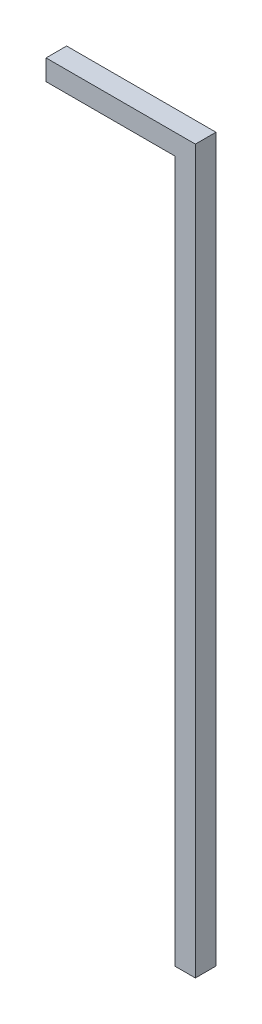
ISO-10303-21;
HEADER;
FILE_DESCRIPTION(('STEP AP214'),'2;1');
FILE_NAME('part.step','',(''),(''),'','','');
FILE_SCHEMA(('AUTOMOTIVE_DESIGN { 1 0 10303 214 1 1 1 1 }'));
ENDSEC;
DATA;
#1=APPLICATION_CONTEXT('core data for automotive mechanical design processes');
#2=APPLICATION_PROTOCOL_DEFINITION('international standard','automotive_design',2000,#1);
#3=PRODUCT_CONTEXT('',#1,'mechanical');
#4=PRODUCT('Part','Part','',(#3));
#5=PRODUCT_RELATED_PRODUCT_CATEGORY('part','',(#4));
#6=PRODUCT_DEFINITION_FORMATION('','',#4);
#7=PRODUCT_DEFINITION_CONTEXT('part definition',#1,'design');
#8=PRODUCT_DEFINITION('design','',#6,#7);
#9=PRODUCT_DEFINITION_SHAPE('','',#8);
#10=(LENGTH_UNIT() NAMED_UNIT(*) SI_UNIT(.MILLI.,.METRE.));
#11=(NAMED_UNIT(*) PLANE_ANGLE_UNIT() SI_UNIT($,.RADIAN.));
#12=(NAMED_UNIT(*) SI_UNIT($,.STERADIAN.) SOLID_ANGLE_UNIT());
#13=UNCERTAINTY_MEASURE_WITH_UNIT(LENGTH_MEASURE(1.E-05),#10,'distance_accuracy_value','');
#14=(GEOMETRIC_REPRESENTATION_CONTEXT(3) GLOBAL_UNCERTAINTY_ASSIGNED_CONTEXT((#13)) GLOBAL_UNIT_ASSIGNED_CONTEXT((#10,
#11,#12)) REPRESENTATION_CONTEXT('',''));
#15=CARTESIAN_POINT('',(0.,0.,0.));
#16=DIRECTION('',(0.,0.,1.));
#17=DIRECTION('',(1.,0.,0.));
#18=AXIS2_PLACEMENT_3D('',#15,#16,#17);
#19=CARTESIAN_POINT('',(259.044918032787,181.491721311476,20.));
#20=DIRECTION('',(1.,0.,0.));
#21=DIRECTION('',(0.,0.,-1.));
#22=AXIS2_PLACEMENT_3D('',#19,#20,#21);
#23=PLANE('',#22);
#24=DIRECTION('',(0.,-1.,0.));
#25=VECTOR('',#24,1.);
#26=CARTESIAN_POINT('',(259.044918032787,181.491721311476,0.));
#27=LINE('',#26,#25);
#28=CARTESIAN_POINT('',(259.044918032787,201.491721311476,0.));
#29=VERTEX_POINT('',#28);
#30=CARTESIAN_POINT('',(259.044918032787,181.491721311476,0.));
#31=VERTEX_POINT('',#30);
#32=EDGE_CURVE('E117',#29,#31,#27,.T.);
#33=ORIENTED_EDGE('',*,*,#32,.T.);
#34=DIRECTION('',(0.,0.,-1.));
#35=VECTOR('',#34,1.);
#36=CARTESIAN_POINT('',(259.044918032787,181.491721311476,20.));
#37=LINE('',#36,#35);
#38=CARTESIAN_POINT('',(259.044918032787,181.491721311476,20.));
#39=VERTEX_POINT('',#38);
#40=EDGE_CURVE('E11',#39,#31,#37,.T.);
#41=ORIENTED_EDGE('',*,*,#40,.F.);
#42=DIRECTION('',(0.,-1.,0.));
#43=VECTOR('',#42,1.);
#44=CARTESIAN_POINT('',(259.044918032787,181.491721311476,20.));
#45=LINE('',#44,#43);
#46=CARTESIAN_POINT('',(259.044918032787,201.491721311476,20.));
#47=VERTEX_POINT('',#46);
#48=EDGE_CURVE('E127',#47,#39,#45,.T.);
#49=ORIENTED_EDGE('',*,*,#48,.F.);
#50=DIRECTION('',(0.,0.,-1.));
#51=VECTOR('',#50,1.);
#52=CARTESIAN_POINT('',(259.044918032787,201.491721311476,20.));
#53=LINE('',#52,#51);
#54=EDGE_CURVE('E113',#47,#29,#53,.T.);
#55=ORIENTED_EDGE('',*,*,#54,.T.);
#56=EDGE_LOOP('',(#33,#41,#49,#55));
#57=FACE_BOUND('',#56,.T.);
#58=ADVANCED_FACE('F33',(#57),#23,.F.);
#59=CARTESIAN_POINT('',(384.044918032787,181.491721311476,20.));
#60=DIRECTION('',(0.,1.,0.));
#61=DIRECTION('',(-1.,0.,0.));
#62=AXIS2_PLACEMENT_3D('',#59,#60,#61);
#63=PLANE('',#62);
#64=DIRECTION('',(1.,0.,0.));
#65=VECTOR('',#64,1.);
#66=CARTESIAN_POINT('',(384.044918032787,181.491721311476,0.));
#67=LINE('',#66,#65);
#68=CARTESIAN_POINT('',(384.044918032787,181.491721311476,0.));
#69=VERTEX_POINT('',#68);
#70=EDGE_CURVE('E120',#31,#69,#67,.T.);
#71=ORIENTED_EDGE('',*,*,#70,.T.);
#72=DIRECTION('',(0.,0.,-1.));
#73=VECTOR('',#72,1.);
#74=CARTESIAN_POINT('',(384.044918032787,181.491721311476,20.));
#75=LINE('',#74,#73);
#76=CARTESIAN_POINT('',(384.044918032787,181.491721311476,20.));
#77=VERTEX_POINT('',#76);
#78=EDGE_CURVE('E41',#77,#69,#75,.T.);
#79=ORIENTED_EDGE('',*,*,#78,.F.);
#80=DIRECTION('',(1.,0.,0.));
#81=VECTOR('',#80,1.);
#82=CARTESIAN_POINT('',(384.044918032787,181.491721311476,20.));
#83=LINE('',#82,#81);
#84=EDGE_CURVE('E86',#39,#77,#83,.T.);
#85=ORIENTED_EDGE('',*,*,#84,.F.);
#86=ORIENTED_EDGE('',*,*,#40,.T.);
#87=EDGE_LOOP('',(#71,#79,#85,#86));
#88=FACE_BOUND('',#87,.T.);
#89=ADVANCED_FACE('F151',(#88),#63,.F.);
#90=CARTESIAN_POINT('',(384.044918032787,-499.838278688524,20.));
#91=DIRECTION('',(1.,0.,0.));
#92=DIRECTION('',(0.,0.,-1.));
#93=AXIS2_PLACEMENT_3D('',#90,#91,#92);
#94=PLANE('',#93);
#95=DIRECTION('',(0.,-1.,0.));
#96=VECTOR('',#95,1.);
#97=CARTESIAN_POINT('',(384.044918032787,-499.838278688524,0.));
#98=LINE('',#97,#96);
#99=CARTESIAN_POINT('',(384.044918032787,-499.838278688524,0.));
#100=VERTEX_POINT('',#99);
#101=EDGE_CURVE('E122',#69,#100,#98,.T.);
#102=ORIENTED_EDGE('',*,*,#101,.T.);
#103=DIRECTION('',(0.,0.,-1.));
#104=VECTOR('',#103,1.);
#105=CARTESIAN_POINT('',(384.044918032787,-499.838278688524,20.));
#106=LINE('',#105,#104);
#107=CARTESIAN_POINT('',(384.044918032787,-499.838278688524,20.));
#108=VERTEX_POINT('',#107);
#109=EDGE_CURVE('E108',#108,#100,#106,.T.);
#110=ORIENTED_EDGE('',*,*,#109,.F.);
#111=DIRECTION('',(0.,-1.,0.));
#112=VECTOR('',#111,1.);
#113=CARTESIAN_POINT('',(384.044918032787,-499.838278688524,20.));
#114=LINE('',#113,#112);
#115=EDGE_CURVE('E99',#77,#108,#114,.T.);
#116=ORIENTED_EDGE('',*,*,#115,.F.);
#117=ORIENTED_EDGE('',*,*,#78,.T.);
#118=EDGE_LOOP('',(#102,#110,#116,#117));
#119=FACE_BOUND('',#118,.T.);
#120=ADVANCED_FACE('F133',(#119),#94,.F.);
#121=CARTESIAN_POINT('',(404.044918032787,-499.838278688524,20.));
#122=DIRECTION('',(0.,1.,0.));
#123=DIRECTION('',(0.,0.,1.));
#124=AXIS2_PLACEMENT_3D('',#121,#122,#123);
#125=PLANE('',#124);
#126=DIRECTION('',(1.,0.,0.));
#127=VECTOR('',#126,1.);
#128=CARTESIAN_POINT('',(404.044918032787,-499.838278688524,0.));
#129=LINE('',#128,#127);
#130=CARTESIAN_POINT('',(404.044918032787,-499.838278688524,0.));
#131=VERTEX_POINT('',#130);
#132=EDGE_CURVE('E107',#100,#131,#129,.T.);
#133=ORIENTED_EDGE('',*,*,#132,.T.);
#134=DIRECTION('',(0.,0.,-1.));
#135=VECTOR('',#134,1.);
#136=CARTESIAN_POINT('',(404.044918032787,-499.838278688524,20.));
#137=LINE('',#136,#135);
#138=CARTESIAN_POINT('',(404.044918032787,-499.838278688524,20.));
#139=VERTEX_POINT('',#138);
#140=EDGE_CURVE('E104',#139,#131,#137,.T.);
#141=ORIENTED_EDGE('',*,*,#140,.F.);
#142=DIRECTION('',(1.,0.,0.));
#143=VECTOR('',#142,1.);
#144=CARTESIAN_POINT('',(404.044918032787,-499.838278688524,20.));
#145=LINE('',#144,#143);
#146=EDGE_CURVE('E93',#108,#139,#145,.T.);
#147=ORIENTED_EDGE('',*,*,#146,.F.);
#148=ORIENTED_EDGE('',*,*,#109,.T.);
#149=EDGE_LOOP('',(#133,#141,#147,#148));
#150=FACE_BOUND('',#149,.T.);
#151=ADVANCED_FACE('F105',(#150),#125,.F.);
#152=CARTESIAN_POINT('',(404.044918032787,201.491721311476,20.));
#153=DIRECTION('',(-1.,0.,0.));
#154=DIRECTION('',(0.,0.,1.));
#155=AXIS2_PLACEMENT_3D('',#152,#153,#154);
#156=PLANE('',#155);
#157=DIRECTION('',(0.,1.,0.));
#158=VECTOR('',#157,1.);
#159=CARTESIAN_POINT('',(404.044918032787,201.491721311476,0.));
#160=LINE('',#159,#158);
#161=CARTESIAN_POINT('',(404.044918032787,201.491721311476,0.));
#162=VERTEX_POINT('',#161);
#163=EDGE_CURVE('E72',#131,#162,#160,.T.);
#164=ORIENTED_EDGE('',*,*,#163,.T.);
#165=DIRECTION('',(0.,0.,-1.));
#166=VECTOR('',#165,1.);
#167=CARTESIAN_POINT('',(404.044918032787,201.491721311476,20.));
#168=LINE('',#167,#166);
#169=CARTESIAN_POINT('',(404.044918032787,201.491721311476,20.));
#170=VERTEX_POINT('',#169);
#171=EDGE_CURVE('E109',#170,#162,#168,.T.);
#172=ORIENTED_EDGE('',*,*,#171,.F.);
#173=DIRECTION('',(0.,1.,0.));
#174=VECTOR('',#173,1.);
#175=CARTESIAN_POINT('',(404.044918032787,201.491721311476,20.));
#176=LINE('',#175,#174);
#177=EDGE_CURVE('E97',#139,#170,#176,.T.);
#178=ORIENTED_EDGE('',*,*,#177,.F.);
#179=ORIENTED_EDGE('',*,*,#140,.T.);
#180=EDGE_LOOP('',(#164,#172,#178,#179));
#181=FACE_BOUND('',#180,.T.);
#182=ADVANCED_FACE('F111',(#181),#156,.F.);
#183=CARTESIAN_POINT('',(259.044918032787,201.491721311476,20.));
#184=DIRECTION('',(0.,-1.,0.));
#185=DIRECTION('',(0.,0.,-1.));
#186=AXIS2_PLACEMENT_3D('',#183,#184,#185);
#187=PLANE('',#186);
#188=DIRECTION('',(-1.,0.,0.));
#189=VECTOR('',#188,1.);
#190=CARTESIAN_POINT('',(259.044918032787,201.491721311476,0.));
#191=LINE('',#190,#189);
#192=EDGE_CURVE('E78',#162,#29,#191,.T.);
#193=ORIENTED_EDGE('',*,*,#192,.T.);
#194=ORIENTED_EDGE('',*,*,#54,.F.);
#195=DIRECTION('',(-1.,0.,0.));
#196=VECTOR('',#195,1.);
#197=CARTESIAN_POINT('',(259.044918032787,201.491721311476,20.));
#198=LINE('',#197,#196);
#199=EDGE_CURVE('E49',#170,#47,#198,.T.);
#200=ORIENTED_EDGE('',*,*,#199,.F.);
#201=ORIENTED_EDGE('',*,*,#171,.T.);
#202=EDGE_LOOP('',(#193,#194,#200,#201));
#203=FACE_BOUND('',#202,.T.);
#204=ADVANCED_FACE('F140',(#203),#187,.F.);
#205=CARTESIAN_POINT('',(0.,0.,20.));
#206=DIRECTION('',(0.,0.,-1.));
#207=DIRECTION('',(-1.,0.,0.));
#208=AXIS2_PLACEMENT_3D('',#205,#206,#207);
#209=PLANE('',#208);
#210=ORIENTED_EDGE('',*,*,#48,.T.);
#211=ORIENTED_EDGE('',*,*,#84,.T.);
#212=ORIENTED_EDGE('',*,*,#115,.T.);
#213=ORIENTED_EDGE('',*,*,#146,.T.);
#214=ORIENTED_EDGE('',*,*,#177,.T.);
#215=ORIENTED_EDGE('',*,*,#199,.T.);
#216=EDGE_LOOP('',(#210,#211,#212,#213,#214,#215));
#217=FACE_BOUND('',#216,.T.);
#218=ADVANCED_FACE('F95',(#217),#209,.F.);
#219=CARTESIAN_POINT('',(0.,0.,0.));
#220=DIRECTION('',(0.,0.,-1.));
#221=DIRECTION('',(-1.,0.,0.));
#222=AXIS2_PLACEMENT_3D('',#219,#220,#221);
#223=PLANE('',#222);
#224=ORIENTED_EDGE('',*,*,#32,.F.);
#225=ORIENTED_EDGE('',*,*,#192,.F.);
#226=ORIENTED_EDGE('',*,*,#163,.F.);
#227=ORIENTED_EDGE('',*,*,#132,.F.);
#228=ORIENTED_EDGE('',*,*,#101,.F.);
#229=ORIENTED_EDGE('',*,*,#70,.F.);
#230=EDGE_LOOP('',(#224,#225,#226,#227,#228,#229));
#231=FACE_BOUND('',#230,.T.);
#232=ADVANCED_FACE('F136',(#231),#223,.T.);
#233=CLOSED_SHELL('',(#58,#89,#120,#151,#182,#204,#218,#232));
#234=MANIFOLD_SOLID_BREP('B2',#233);
#235=ADVANCED_BREP_SHAPE_REPRESENTATION('',(#18,#234),#14);
#236=SHAPE_DEFINITION_REPRESENTATION(#9,#235);
ENDSEC;
END-ISO-10303-21;
